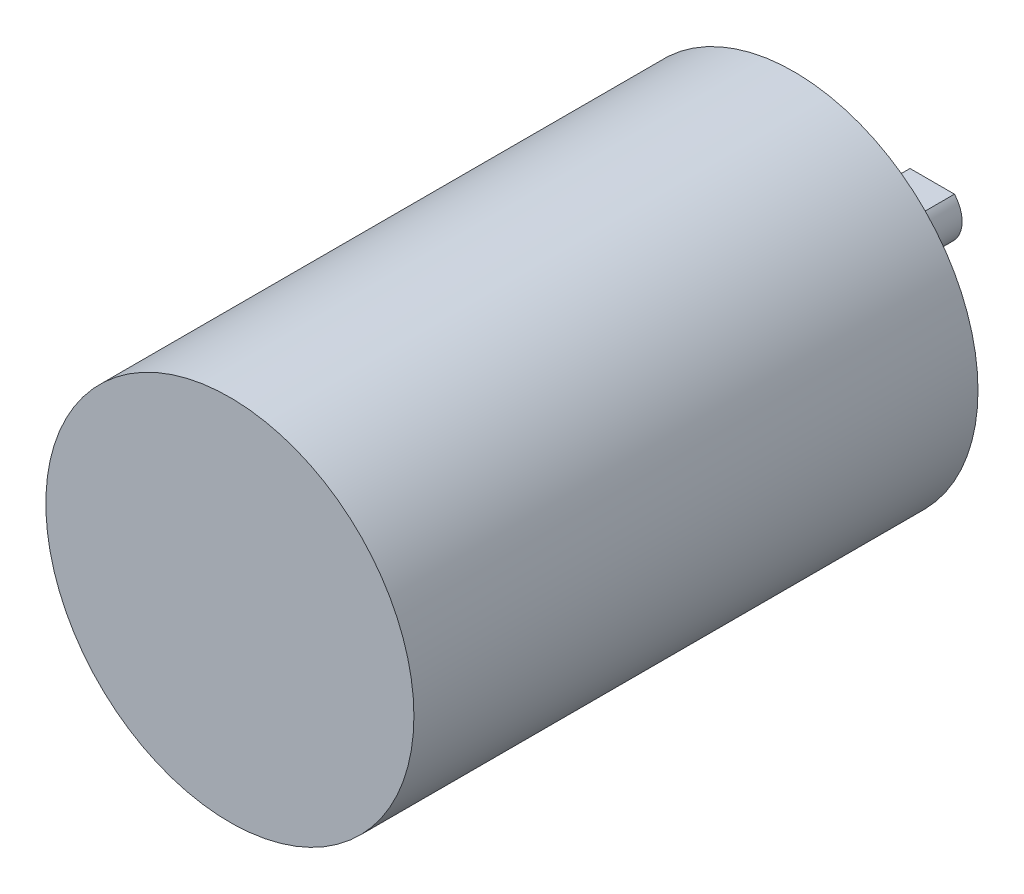
ISO-10303-21;
HEADER;
FILE_DESCRIPTION(('STEP AP214'),'2;1');
FILE_NAME('part.step','',(''),(''),'','','');
FILE_SCHEMA(('AUTOMOTIVE_DESIGN { 1 0 10303 214 1 1 1 1 }'));
ENDSEC;
DATA;
#1=APPLICATION_CONTEXT('core data for automotive mechanical design processes');
#2=APPLICATION_PROTOCOL_DEFINITION('international standard','automotive_design',2000,#1);
#3=PRODUCT_CONTEXT('',#1,'mechanical');
#4=PRODUCT('Part','Part','',(#3));
#5=PRODUCT_RELATED_PRODUCT_CATEGORY('part','',(#4));
#6=PRODUCT_DEFINITION_FORMATION('','',#4);
#7=PRODUCT_DEFINITION_CONTEXT('part definition',#1,'design');
#8=PRODUCT_DEFINITION('design','',#6,#7);
#9=PRODUCT_DEFINITION_SHAPE('','',#8);
#10=(LENGTH_UNIT() NAMED_UNIT(*) SI_UNIT(.MILLI.,.METRE.));
#11=(NAMED_UNIT(*) PLANE_ANGLE_UNIT() SI_UNIT($,.RADIAN.));
#12=(NAMED_UNIT(*) SI_UNIT($,.STERADIAN.) SOLID_ANGLE_UNIT());
#13=UNCERTAINTY_MEASURE_WITH_UNIT(LENGTH_MEASURE(1.E-05),#10,'distance_accuracy_value','');
#14=(GEOMETRIC_REPRESENTATION_CONTEXT(3) GLOBAL_UNCERTAINTY_ASSIGNED_CONTEXT((#13)) GLOBAL_UNIT_ASSIGNED_CONTEXT((#10,
#11,#12)) REPRESENTATION_CONTEXT('',''));
#15=CARTESIAN_POINT('',(0.,0.,0.));
#16=DIRECTION('',(0.,0.,1.));
#17=DIRECTION('',(1.,0.,0.));
#18=AXIS2_PLACEMENT_3D('',#15,#16,#17);
#19=CARTESIAN_POINT('',(0.,0.,56.7));
#20=DIRECTION('',(0.,0.,-1.));
#21=DIRECTION('',(-1.,0.,0.));
#22=AXIS2_PLACEMENT_3D('',#19,#20,#21);
#23=CYLINDRICAL_SURFACE('',#22,18.5);
#24=CARTESIAN_POINT('',(0.,0.,56.7));
#25=DIRECTION('',(0.,0.,1.));
#26=DIRECTION('',(1.,0.,0.));
#27=AXIS2_PLACEMENT_3D('',#24,#25,#26);
#28=CIRCLE('',#27,18.5);
#29=CARTESIAN_POINT('',(18.5,0.,56.7));
#30=VERTEX_POINT('',#29);
#31=EDGE_CURVE('E47',#30,#30,#28,.T.);
#32=ORIENTED_EDGE('',*,*,#31,.F.);
#33=EDGE_LOOP('',(#32));
#34=FACE_BOUND('',#33,.T.);
#35=CARTESIAN_POINT('',(0.,0.,0.));
#36=DIRECTION('',(0.,0.,1.));
#37=DIRECTION('',(1.,0.,0.));
#38=AXIS2_PLACEMENT_3D('',#35,#36,#37);
#39=CIRCLE('',#38,18.5);
#40=CARTESIAN_POINT('',(18.5,0.,0.));
#41=VERTEX_POINT('',#40);
#42=EDGE_CURVE('E42',#41,#41,#39,.T.);
#43=ORIENTED_EDGE('',*,*,#42,.T.);
#44=EDGE_LOOP('',(#43));
#45=FACE_BOUND('',#44,.T.);
#46=ADVANCED_FACE('F39',(#34,#45),#23,.T.);
#47=CARTESIAN_POINT('',(0.,0.,56.7));
#48=DIRECTION('',(0.,0.,1.));
#49=DIRECTION('',(1.,0.,0.));
#50=AXIS2_PLACEMENT_3D('',#47,#48,#49);
#51=PLANE('',#50);
#52=ORIENTED_EDGE('',*,*,#31,.T.);
#53=EDGE_LOOP('',(#52));
#54=FACE_BOUND('',#53,.T.);
#55=ADVANCED_FACE('F98',(#54),#51,.T.);
#56=CARTESIAN_POINT('',(0.,0.,0.));
#57=DIRECTION('',(0.,0.,1.));
#58=DIRECTION('',(1.,0.,0.));
#59=AXIS2_PLACEMENT_3D('',#56,#57,#58);
#60=PLANE('',#59);
#61=CARTESIAN_POINT('',(0.,0.,0.));
#62=DIRECTION('',(0.,0.,1.));
#63=DIRECTION('',(1.,0.,0.));
#64=AXIS2_PLACEMENT_3D('',#61,#62,#63);
#65=CIRCLE('',#64,6.);
#66=CARTESIAN_POINT('',(6.,0.,0.));
#67=VERTEX_POINT('',#66);
#68=EDGE_CURVE('E80',#67,#67,#65,.T.);
#69=ORIENTED_EDGE('',*,*,#68,.T.);
#70=EDGE_LOOP('',(#69));
#71=FACE_BOUND('',#70,.T.);
#72=ORIENTED_EDGE('',*,*,#42,.F.);
#73=EDGE_LOOP('',(#72));
#74=FACE_BOUND('',#73,.T.);
#75=ADVANCED_FACE('F95',(#71,#74),#60,.F.);
#76=CARTESIAN_POINT('',(0.,0.,-3.5));
#77=DIRECTION('',(0.,0.,1.));
#78=DIRECTION('',(1.,0.,0.));
#79=AXIS2_PLACEMENT_3D('',#76,#77,#78);
#80=CYLINDRICAL_SURFACE('',#79,6.);
#81=CARTESIAN_POINT('',(0.,0.,-3.5));
#82=DIRECTION('',(0.,0.,1.));
#83=DIRECTION('',(1.,0.,0.));
#84=AXIS2_PLACEMENT_3D('',#81,#82,#83);
#85=CIRCLE('',#84,6.);
#86=CARTESIAN_POINT('',(6.,0.,-3.5));
#87=VERTEX_POINT('',#86);
#88=EDGE_CURVE('E83',#87,#87,#85,.T.);
#89=ORIENTED_EDGE('',*,*,#88,.T.);
#90=EDGE_LOOP('',(#89));
#91=FACE_BOUND('',#90,.T.);
#92=ORIENTED_EDGE('',*,*,#68,.F.);
#93=EDGE_LOOP('',(#92));
#94=FACE_BOUND('',#93,.T.);
#95=ADVANCED_FACE('F97',(#91,#94),#80,.T.);
#96=CARTESIAN_POINT('',(0.,0.,-3.5));
#97=DIRECTION('',(0.,0.,1.));
#98=DIRECTION('',(1.,0.,0.));
#99=AXIS2_PLACEMENT_3D('',#96,#97,#98);
#100=PLANE('',#99);
#101=CARTESIAN_POINT('',(0.,0.,-3.5));
#102=DIRECTION('',(0.,0.,-1.));
#103=DIRECTION('',(-1.,0.,0.));
#104=AXIS2_PLACEMENT_3D('',#101,#102,#103);
#105=CIRCLE('',#104,3.);
#106=CARTESIAN_POINT('',(-3.,0.,-3.5));
#107=VERTEX_POINT('',#106);
#108=EDGE_CURVE('E11',#107,#107,#105,.T.);
#109=ORIENTED_EDGE('',*,*,#108,.F.);
#110=EDGE_LOOP('',(#109));
#111=FACE_BOUND('',#110,.T.);
#112=ORIENTED_EDGE('',*,*,#88,.F.);
#113=EDGE_LOOP('',(#112));
#114=FACE_BOUND('',#113,.T.);
#115=ADVANCED_FACE('F104',(#111,#114),#100,.F.);
#116=CARTESIAN_POINT('',(0.,0.,-13.9));
#117=DIRECTION('',(0.,0.,1.));
#118=DIRECTION('',(1.,0.,0.));
#119=AXIS2_PLACEMENT_3D('',#116,#117,#118);
#120=CYLINDRICAL_SURFACE('',#119,3.);
#121=CARTESIAN_POINT('',(0.,0.,-13.9));
#122=DIRECTION('',(0.,0.,-1.));
#123=DIRECTION('',(-1.,0.,0.));
#124=AXIS2_PLACEMENT_3D('',#121,#122,#123);
#125=CIRCLE('',#124,3.);
#126=CARTESIAN_POINT('',(2.23606797749979,2.,-13.9));
#127=VERTEX_POINT('',#126);
#128=CARTESIAN_POINT('',(-2.23606797749979,2.,-13.9));
#129=VERTEX_POINT('',#128);
#130=EDGE_CURVE('E77',#127,#129,#125,.T.);
#131=ORIENTED_EDGE('',*,*,#130,.F.);
#132=DIRECTION('',(0.,0.,-1.));
#133=VECTOR('',#132,1.);
#134=CARTESIAN_POINT('',(2.23606797749979,2.,-5.9));
#135=LINE('',#134,#133);
#136=CARTESIAN_POINT('',(2.23606797749979,2.,-5.9));
#137=VERTEX_POINT('',#136);
#138=EDGE_CURVE('E55',#137,#127,#135,.T.);
#139=ORIENTED_EDGE('',*,*,#138,.F.);
#140=CARTESIAN_POINT('',(0.,0.,-5.9));
#141=DIRECTION('',(0.,0.,-1.));
#142=DIRECTION('',(-1.,0.,0.));
#143=AXIS2_PLACEMENT_3D('',#140,#141,#142);
#144=CIRCLE('',#143,3.);
#145=CARTESIAN_POINT('',(-2.23606797749979,2.,-5.9));
#146=VERTEX_POINT('',#145);
#147=EDGE_CURVE('E71',#146,#137,#144,.T.);
#148=ORIENTED_EDGE('',*,*,#147,.F.);
#149=DIRECTION('',(0.,0.,-1.));
#150=VECTOR('',#149,1.);
#151=CARTESIAN_POINT('',(-2.23606797749979,2.,-5.9));
#152=LINE('',#151,#150);
#153=EDGE_CURVE('E61',#146,#129,#152,.T.);
#154=ORIENTED_EDGE('',*,*,#153,.T.);
#155=EDGE_LOOP('',(#131,#139,#148,#154));
#156=FACE_BOUND('',#155,.T.);
#157=ORIENTED_EDGE('',*,*,#108,.T.);
#158=EDGE_LOOP('',(#157));
#159=FACE_BOUND('',#158,.T.);
#160=ADVANCED_FACE('F75',(#156,#159),#120,.T.);
#161=CARTESIAN_POINT('',(0.,0.,-13.9));
#162=DIRECTION('',(0.,0.,-1.));
#163=DIRECTION('',(-1.,0.,0.));
#164=AXIS2_PLACEMENT_3D('',#161,#162,#163);
#165=PLANE('',#164);
#166=DIRECTION('',(-1.,0.,0.));
#167=VECTOR('',#166,1.);
#168=CARTESIAN_POINT('',(2.23606797749979,2.,-13.9));
#169=LINE('',#168,#167);
#170=EDGE_CURVE('E66',#127,#129,#169,.T.);
#171=ORIENTED_EDGE('',*,*,#170,.F.);
#172=ORIENTED_EDGE('',*,*,#130,.T.);
#173=EDGE_LOOP('',(#171,#172));
#174=FACE_BOUND('',#173,.T.);
#175=ADVANCED_FACE('F79',(#174),#165,.T.);
#176=CARTESIAN_POINT('',(2.23606797749979,2.,-5.9));
#177=DIRECTION('',(0.,-1.,0.));
#178=DIRECTION('',(0.,0.,-1.));
#179=AXIS2_PLACEMENT_3D('',#176,#177,#178);
#180=PLANE('',#179);
#181=ORIENTED_EDGE('',*,*,#170,.T.);
#182=ORIENTED_EDGE('',*,*,#153,.F.);
#183=DIRECTION('',(-1.,0.,0.));
#184=VECTOR('',#183,1.);
#185=CARTESIAN_POINT('',(2.23606797749979,2.,-5.9));
#186=LINE('',#185,#184);
#187=EDGE_CURVE('E173',#137,#146,#186,.T.);
#188=ORIENTED_EDGE('',*,*,#187,.F.);
#189=ORIENTED_EDGE('',*,*,#138,.T.);
#190=EDGE_LOOP('',(#181,#182,#188,#189));
#191=FACE_BOUND('',#190,.T.);
#192=ADVANCED_FACE('F67',(#191),#180,.F.);
#193=CARTESIAN_POINT('',(0.,0.,-5.9));
#194=DIRECTION('',(0.,0.,-1.));
#195=DIRECTION('',(-1.,0.,0.));
#196=AXIS2_PLACEMENT_3D('',#193,#194,#195);
#197=PLANE('',#196);
#198=ORIENTED_EDGE('',*,*,#147,.T.);
#199=ORIENTED_EDGE('',*,*,#187,.T.);
#200=EDGE_LOOP('',(#198,#199));
#201=FACE_BOUND('',#200,.T.);
#202=ADVANCED_FACE('F160',(#201),#197,.T.);
#203=CLOSED_SHELL('',(#46,#55,#75,#95,#115,#160,#175,#192,#202));
#204=MANIFOLD_SOLID_BREP('B2',#203);
#205=ADVANCED_BREP_SHAPE_REPRESENTATION('',(#18,#204),#14);
#206=SHAPE_DEFINITION_REPRESENTATION(#9,#205);
ENDSEC;
END-ISO-10303-21;
